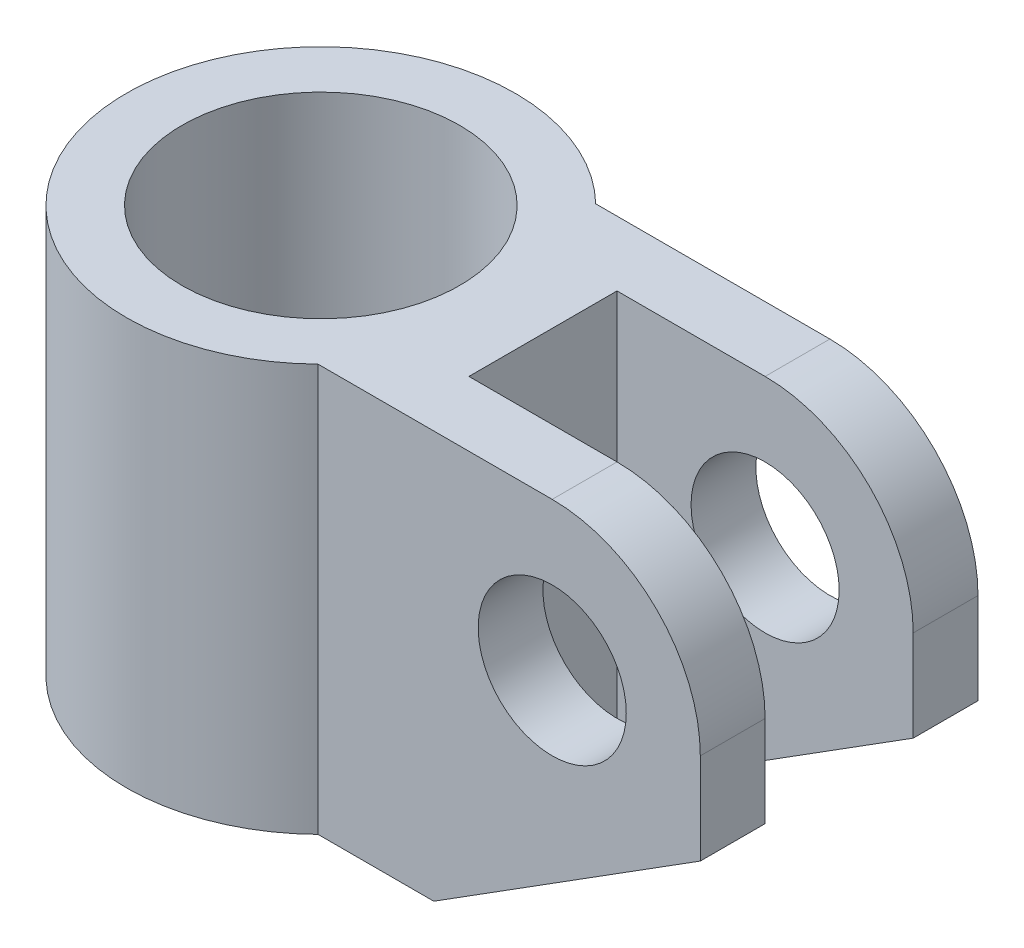
ISO-10303-21;
HEADER;
FILE_DESCRIPTION(('STEP AP214'),'2;1');
FILE_NAME('part.step','',(''),(''),'','','');
FILE_SCHEMA(('AUTOMOTIVE_DESIGN { 1 0 10303 214 1 1 1 1 }'));
ENDSEC;
DATA;
#1=APPLICATION_CONTEXT('core data for automotive mechanical design processes');
#2=APPLICATION_PROTOCOL_DEFINITION('international standard','automotive_design',2000,#1);
#3=PRODUCT_CONTEXT('',#1,'mechanical');
#4=PRODUCT('Part','Part','',(#3));
#5=PRODUCT_RELATED_PRODUCT_CATEGORY('part','',(#4));
#6=PRODUCT_DEFINITION_FORMATION('','',#4);
#7=PRODUCT_DEFINITION_CONTEXT('part definition',#1,'design');
#8=PRODUCT_DEFINITION('design','',#6,#7);
#9=PRODUCT_DEFINITION_SHAPE('','',#8);
#10=(LENGTH_UNIT() NAMED_UNIT(*) SI_UNIT(.MILLI.,.METRE.));
#11=(NAMED_UNIT(*) PLANE_ANGLE_UNIT() SI_UNIT($,.RADIAN.));
#12=(NAMED_UNIT(*) SI_UNIT($,.STERADIAN.) SOLID_ANGLE_UNIT());
#13=UNCERTAINTY_MEASURE_WITH_UNIT(LENGTH_MEASURE(1.E-05),#10,'distance_accuracy_value','');
#14=(GEOMETRIC_REPRESENTATION_CONTEXT(3) GLOBAL_UNCERTAINTY_ASSIGNED_CONTEXT((#13)) GLOBAL_UNIT_ASSIGNED_CONTEXT((#10,
#11,#12)) REPRESENTATION_CONTEXT('',''));
#15=CARTESIAN_POINT('',(0.,0.,0.));
#16=DIRECTION('',(0.,0.,1.));
#17=DIRECTION('',(1.,0.,0.));
#18=AXIS2_PLACEMENT_3D('',#15,#16,#17);
#19=CARTESIAN_POINT('',(0.,22.,0.));
#20=DIRECTION('',(0.,1.,0.));
#21=DIRECTION('',(0.,0.,1.));
#22=AXIS2_PLACEMENT_3D('',#19,#20,#21);
#23=PLANE('',#22);
#24=DIRECTION('',(0.,0.,1.));
#25=VECTOR('',#24,1.);
#26=CARTESIAN_POINT('',(20.,22.,-24.5206646639548));
#27=LINE('',#26,#25);
#28=CARTESIAN_POINT('',(20.,22.,-7.5));
#29=VERTEX_POINT('',#28);
#30=CARTESIAN_POINT('',(20.,22.,-4.));
#31=VERTEX_POINT('',#30);
#32=EDGE_CURVE('E57',#29,#31,#27,.T.);
#33=ORIENTED_EDGE('',*,*,#32,.F.);
#34=DIRECTION('',(-1.,0.,0.));
#35=VECTOR('',#34,1.);
#36=CARTESIAN_POINT('',(28.,22.,-7.5));
#37=LINE('',#36,#35);
#38=CARTESIAN_POINT('',(7.34846922834953,22.,-7.5));
#39=VERTEX_POINT('',#38);
#40=EDGE_CURVE('E196',#29,#39,#37,.T.);
#41=ORIENTED_EDGE('',*,*,#40,.T.);
#42=CARTESIAN_POINT('',(0.,22.,0.));
#43=DIRECTION('',(0.,1.,0.));
#44=DIRECTION('',(0.,0.,1.));
#45=AXIS2_PLACEMENT_3D('',#42,#43,#44);
#46=CIRCLE('',#45,10.5);
#47=CARTESIAN_POINT('',(7.34846922834953,22.,7.5));
#48=VERTEX_POINT('',#47);
#49=EDGE_CURVE('E198',#39,#48,#46,.T.);
#50=ORIENTED_EDGE('',*,*,#49,.T.);
#51=DIRECTION('',(1.,0.,0.));
#52=VECTOR('',#51,1.);
#53=CARTESIAN_POINT('',(28.,22.,7.5));
#54=LINE('',#53,#52);
#55=CARTESIAN_POINT('',(20.,22.,7.5));
#56=VERTEX_POINT('',#55);
#57=EDGE_CURVE('E201',#48,#56,#54,.T.);
#58=ORIENTED_EDGE('',*,*,#57,.T.);
#59=CARTESIAN_POINT('',(20.,22.,4.));
#60=VERTEX_POINT('',#59);
#61=EDGE_CURVE('E123',#60,#56,#27,.T.);
#62=ORIENTED_EDGE('',*,*,#61,.F.);
#63=DIRECTION('',(-1.,0.,0.));
#64=VECTOR('',#63,1.);
#65=CARTESIAN_POINT('',(28.,22.,4.));
#66=LINE('',#65,#64);
#67=CARTESIAN_POINT('',(12.,22.,4.));
#68=VERTEX_POINT('',#67);
#69=EDGE_CURVE('E203',#60,#68,#66,.T.);
#70=ORIENTED_EDGE('',*,*,#69,.T.);
#71=DIRECTION('',(0.,0.,-1.));
#72=VECTOR('',#71,1.);
#73=CARTESIAN_POINT('',(12.,22.,4.));
#74=LINE('',#73,#72);
#75=CARTESIAN_POINT('',(12.,22.,-4.));
#76=VERTEX_POINT('',#75);
#77=EDGE_CURVE('E205',#68,#76,#74,.T.);
#78=ORIENTED_EDGE('',*,*,#77,.T.);
#79=DIRECTION('',(1.,0.,0.));
#80=VECTOR('',#79,1.);
#81=CARTESIAN_POINT('',(28.,22.,-4.));
#82=LINE('',#81,#80);
#83=EDGE_CURVE('E207',#76,#31,#82,.T.);
#84=ORIENTED_EDGE('',*,*,#83,.T.);
#85=EDGE_LOOP('',(#33,#41,#50,#58,#62,#70,#78,#84));
#86=FACE_BOUND('',#85,.T.);
#87=CARTESIAN_POINT('',(0.,22.,0.));
#88=DIRECTION('',(0.,1.,0.));
#89=DIRECTION('',(0.,0.,1.));
#90=AXIS2_PLACEMENT_3D('',#87,#88,#89);
#91=CIRCLE('',#90,7.5);
#92=CARTESIAN_POINT('',(0.,22.,7.5));
#93=VERTEX_POINT('',#92);
#94=EDGE_CURVE('E190',#93,#93,#91,.T.);
#95=ORIENTED_EDGE('',*,*,#94,.F.);
#96=EDGE_LOOP('',(#95));
#97=FACE_BOUND('',#96,.T.);
#98=ADVANCED_FACE('F34',(#86,#97),#23,.T.);
#99=CARTESIAN_POINT('',(0.,0.,0.));
#100=DIRECTION('',(0.,1.,0.));
#101=DIRECTION('',(0.,0.,1.));
#102=AXIS2_PLACEMENT_3D('',#99,#100,#101);
#103=PLANE('',#102);
#104=DIRECTION('',(-1.,0.,0.));
#105=VECTOR('',#104,1.);
#106=CARTESIAN_POINT('',(28.,0.,-7.5));
#107=LINE('',#106,#105);
#108=CARTESIAN_POINT('',(13.6020077384735,0.,-7.5));
#109=VERTEX_POINT('',#108);
#110=CARTESIAN_POINT('',(7.34846922834953,0.,-7.5));
#111=VERTEX_POINT('',#110);
#112=EDGE_CURVE('E193',#109,#111,#107,.T.);
#113=ORIENTED_EDGE('',*,*,#112,.F.);
#114=DIRECTION('',(0.,0.,1.));
#115=VECTOR('',#114,1.);
#116=CARTESIAN_POINT('',(13.6020077384735,0.,-24.5206646639548));
#117=LINE('',#116,#115);
#118=CARTESIAN_POINT('',(13.6020077384735,0.,-4.));
#119=VERTEX_POINT('',#118);
#120=EDGE_CURVE('E176',#109,#119,#117,.T.);
#121=ORIENTED_EDGE('',*,*,#120,.T.);
#122=DIRECTION('',(1.,0.,0.));
#123=VECTOR('',#122,1.);
#124=CARTESIAN_POINT('',(28.,0.,-4.));
#125=LINE('',#124,#123);
#126=CARTESIAN_POINT('',(12.,0.,-4.));
#127=VERTEX_POINT('',#126);
#128=EDGE_CURVE('E199',#127,#119,#125,.T.);
#129=ORIENTED_EDGE('',*,*,#128,.F.);
#130=DIRECTION('',(0.,0.,-1.));
#131=VECTOR('',#130,1.);
#132=CARTESIAN_POINT('',(12.,0.,4.));
#133=LINE('',#132,#131);
#134=CARTESIAN_POINT('',(12.,0.,4.));
#135=VERTEX_POINT('',#134);
#136=EDGE_CURVE('E218',#135,#127,#133,.T.);
#137=ORIENTED_EDGE('',*,*,#136,.F.);
#138=DIRECTION('',(-1.,0.,0.));
#139=VECTOR('',#138,1.);
#140=CARTESIAN_POINT('',(28.,0.,4.));
#141=LINE('',#140,#139);
#142=CARTESIAN_POINT('',(13.6020077384735,0.,4.));
#143=VERTEX_POINT('',#142);
#144=EDGE_CURVE('E216',#143,#135,#141,.T.);
#145=ORIENTED_EDGE('',*,*,#144,.F.);
#146=CARTESIAN_POINT('',(13.6020077384735,0.,7.5));
#147=VERTEX_POINT('',#146);
#148=EDGE_CURVE('E180',#143,#147,#117,.T.);
#149=ORIENTED_EDGE('',*,*,#148,.T.);
#150=DIRECTION('',(1.,0.,0.));
#151=VECTOR('',#150,1.);
#152=CARTESIAN_POINT('',(28.,0.,7.5));
#153=LINE('',#152,#151);
#154=CARTESIAN_POINT('',(7.34846922834953,0.,7.5));
#155=VERTEX_POINT('',#154);
#156=EDGE_CURVE('E214',#155,#147,#153,.T.);
#157=ORIENTED_EDGE('',*,*,#156,.F.);
#158=CARTESIAN_POINT('',(0.,0.,0.));
#159=DIRECTION('',(0.,1.,0.));
#160=DIRECTION('',(0.,0.,1.));
#161=AXIS2_PLACEMENT_3D('',#158,#159,#160);
#162=CIRCLE('',#161,10.5);
#163=EDGE_CURVE('E212',#111,#155,#162,.T.);
#164=ORIENTED_EDGE('',*,*,#163,.F.);
#165=EDGE_LOOP('',(#113,#121,#129,#137,#145,#149,#157,#164));
#166=FACE_BOUND('',#165,.T.);
#167=CARTESIAN_POINT('',(0.,0.,0.));
#168=DIRECTION('',(0.,1.,0.));
#169=DIRECTION('',(0.,0.,1.));
#170=AXIS2_PLACEMENT_3D('',#167,#168,#169);
#171=CIRCLE('',#170,7.5);
#172=CARTESIAN_POINT('',(0.,0.,7.5));
#173=VERTEX_POINT('',#172);
#174=EDGE_CURVE('E189',#173,#173,#171,.T.);
#175=ORIENTED_EDGE('',*,*,#174,.T.);
#176=EDGE_LOOP('',(#175));
#177=FACE_BOUND('',#176,.T.);
#178=ADVANCED_FACE('F238',(#166,#177),#103,.F.);
#179=CARTESIAN_POINT('',(28.,22.,-7.5));
#180=DIRECTION('',(-1.,0.,0.));
#181=DIRECTION('',(0.,0.,1.));
#182=AXIS2_PLACEMENT_3D('',#179,#180,#181);
#183=PLANE('',#182);
#184=DIRECTION('',(0.,-1.,0.));
#185=VECTOR('',#184,1.);
#186=CARTESIAN_POINT('',(28.,22.,-7.5));
#187=LINE('',#186,#185);
#188=CARTESIAN_POINT('',(28.,14.,-7.5));
#189=VERTEX_POINT('',#188);
#190=CARTESIAN_POINT('',(28.,9.07749108728972,-7.5));
#191=VERTEX_POINT('',#190);
#192=EDGE_CURVE('E153',#189,#191,#187,.T.);
#193=ORIENTED_EDGE('',*,*,#192,.F.);
#194=DIRECTION('',(0.,0.,1.));
#195=VECTOR('',#194,1.);
#196=CARTESIAN_POINT('',(28.,14.,-24.5206646639548));
#197=LINE('',#196,#195);
#198=CARTESIAN_POINT('',(28.,14.,-4.));
#199=VERTEX_POINT('',#198);
#200=EDGE_CURVE('E136',#189,#199,#197,.T.);
#201=ORIENTED_EDGE('',*,*,#200,.T.);
#202=DIRECTION('',(0.,-1.,0.));
#203=VECTOR('',#202,1.);
#204=CARTESIAN_POINT('',(28.,22.,-4.));
#205=LINE('',#204,#203);
#206=CARTESIAN_POINT('',(28.,9.07749108728972,-4.));
#207=VERTEX_POINT('',#206);
#208=EDGE_CURVE('E210',#199,#207,#205,.T.);
#209=ORIENTED_EDGE('',*,*,#208,.T.);
#210=DIRECTION('',(0.,0.,1.));
#211=VECTOR('',#210,1.);
#212=CARTESIAN_POINT('',(28.,9.07749108728972,-24.5206646639548));
#213=LINE('',#212,#211);
#214=EDGE_CURVE('E181',#191,#207,#213,.T.);
#215=ORIENTED_EDGE('',*,*,#214,.F.);
#216=EDGE_LOOP('',(#193,#201,#209,#215));
#217=FACE_BOUND('',#216,.T.);
#218=ADVANCED_FACE('F36',(#217),#183,.F.);
#219=CARTESIAN_POINT('',(28.,22.,-7.5));
#220=DIRECTION('',(0.,0.,1.));
#221=DIRECTION('',(1.,0.,0.));
#222=AXIS2_PLACEMENT_3D('',#219,#220,#221);
#223=PLANE('',#222);
#224=CARTESIAN_POINT('',(20.,14.,-7.5));
#225=DIRECTION('',(0.,0.,1.));
#226=DIRECTION('',(1.,0.,0.));
#227=AXIS2_PLACEMENT_3D('',#224,#225,#226);
#228=CIRCLE('',#227,4.);
#229=CARTESIAN_POINT('',(24.,14.,-7.5));
#230=VERTEX_POINT('',#229);
#231=EDGE_CURVE('E159',#230,#230,#228,.F.);
#232=ORIENTED_EDGE('',*,*,#231,.F.);
#233=EDGE_LOOP('',(#232));
#234=FACE_BOUND('',#233,.T.);
#235=ORIENTED_EDGE('',*,*,#40,.F.);
#236=CARTESIAN_POINT('',(20.,14.,-7.5));
#237=DIRECTION('',(0.,0.,1.));
#238=DIRECTION('',(1.,0.,0.));
#239=AXIS2_PLACEMENT_3D('',#236,#237,#238);
#240=CIRCLE('',#239,8.);
#241=EDGE_CURVE('E250',#189,#29,#240,.T.);
#242=ORIENTED_EDGE('',*,*,#241,.F.);
#243=ORIENTED_EDGE('',*,*,#192,.T.);
#244=DIRECTION('',(0.845912456757199,0.53332177482548,0.));
#245=VECTOR('',#244,1.);
#246=CARTESIAN_POINT('',(28.,9.07749108728972,-7.5));
#247=LINE('',#246,#245);
#248=EDGE_CURVE('E179',#109,#191,#247,.T.);
#249=ORIENTED_EDGE('',*,*,#248,.F.);
#250=ORIENTED_EDGE('',*,*,#112,.T.);
#251=DIRECTION('',(0.,-1.,0.));
#252=VECTOR('',#251,1.);
#253=CARTESIAN_POINT('',(7.34846922834953,22.,-7.5));
#254=LINE('',#253,#252);
#255=EDGE_CURVE('E145',#39,#111,#254,.T.);
#256=ORIENTED_EDGE('',*,*,#255,.F.);
#257=EDGE_LOOP('',(#235,#242,#243,#249,#250,#256));
#258=FACE_BOUND('',#257,.T.);
#259=ADVANCED_FACE('F260',(#234,#258),#223,.F.);
#260=CARTESIAN_POINT('',(0.,22.,0.));
#261=DIRECTION('',(0.,-1.,0.));
#262=DIRECTION('',(0.,0.,-1.));
#263=AXIS2_PLACEMENT_3D('',#260,#261,#262);
#264=CYLINDRICAL_SURFACE('',#263,10.5);
#265=ORIENTED_EDGE('',*,*,#163,.T.);
#266=DIRECTION('',(0.,-1.,0.));
#267=VECTOR('',#266,1.);
#268=CARTESIAN_POINT('',(7.34846922834953,22.,7.5));
#269=LINE('',#268,#267);
#270=EDGE_CURVE('E142',#48,#155,#269,.T.);
#271=ORIENTED_EDGE('',*,*,#270,.F.);
#272=ORIENTED_EDGE('',*,*,#49,.F.);
#273=ORIENTED_EDGE('',*,*,#255,.T.);
#274=EDGE_LOOP('',(#265,#271,#272,#273));
#275=FACE_BOUND('',#274,.T.);
#276=ADVANCED_FACE('F266',(#275),#264,.T.);
#277=CARTESIAN_POINT('',(28.,22.,7.5));
#278=DIRECTION('',(0.,0.,-1.));
#279=DIRECTION('',(-1.,0.,0.));
#280=AXIS2_PLACEMENT_3D('',#277,#278,#279);
#281=PLANE('',#280);
#282=CARTESIAN_POINT('',(20.,14.,7.5));
#283=DIRECTION('',(0.,0.,1.));
#284=DIRECTION('',(1.,0.,0.));
#285=AXIS2_PLACEMENT_3D('',#282,#283,#284);
#286=CIRCLE('',#285,4.);
#287=CARTESIAN_POINT('',(24.,14.,7.5));
#288=VERTEX_POINT('',#287);
#289=EDGE_CURVE('E165',#288,#288,#286,.T.);
#290=ORIENTED_EDGE('',*,*,#289,.F.);
#291=EDGE_LOOP('',(#290));
#292=FACE_BOUND('',#291,.T.);
#293=DIRECTION('',(0.,-1.,0.));
#294=VECTOR('',#293,1.);
#295=CARTESIAN_POINT('',(28.,22.,7.5));
#296=LINE('',#295,#294);
#297=CARTESIAN_POINT('',(28.,14.,7.5));
#298=VERTEX_POINT('',#297);
#299=CARTESIAN_POINT('',(28.,9.07749108728972,7.5));
#300=VERTEX_POINT('',#299);
#301=EDGE_CURVE('E133',#298,#300,#296,.T.);
#302=ORIENTED_EDGE('',*,*,#301,.F.);
#303=CARTESIAN_POINT('',(20.,14.,7.5));
#304=DIRECTION('',(0.,0.,-1.));
#305=DIRECTION('',(1.,0.,0.));
#306=AXIS2_PLACEMENT_3D('',#303,#304,#305);
#307=CIRCLE('',#306,8.);
#308=EDGE_CURVE('E120',#56,#298,#307,.T.);
#309=ORIENTED_EDGE('',*,*,#308,.F.);
#310=ORIENTED_EDGE('',*,*,#57,.F.);
#311=ORIENTED_EDGE('',*,*,#270,.T.);
#312=ORIENTED_EDGE('',*,*,#156,.T.);
#313=DIRECTION('',(-0.845912456757199,-0.53332177482548,0.));
#314=VECTOR('',#313,1.);
#315=CARTESIAN_POINT('',(28.,9.07749108728972,7.5));
#316=LINE('',#315,#314);
#317=EDGE_CURVE('E141',#300,#147,#316,.T.);
#318=ORIENTED_EDGE('',*,*,#317,.F.);
#319=EDGE_LOOP('',(#302,#309,#310,#311,#312,#318));
#320=FACE_BOUND('',#319,.T.);
#321=ADVANCED_FACE('F139',(#292,#320),#281,.F.);
#322=CARTESIAN_POINT('',(28.,22.,4.));
#323=DIRECTION('',(-1.,0.,0.));
#324=DIRECTION('',(0.,0.,1.));
#325=AXIS2_PLACEMENT_3D('',#322,#323,#324);
#326=PLANE('',#325);
#327=DIRECTION('',(0.,-1.,0.));
#328=VECTOR('',#327,1.);
#329=CARTESIAN_POINT('',(28.,22.,4.));
#330=LINE('',#329,#328);
#331=CARTESIAN_POINT('',(28.,14.,4.));
#332=VERTEX_POINT('',#331);
#333=CARTESIAN_POINT('',(28.,9.07749108728972,4.));
#334=VERTEX_POINT('',#333);
#335=EDGE_CURVE('E135',#332,#334,#330,.T.);
#336=ORIENTED_EDGE('',*,*,#335,.F.);
#337=EDGE_CURVE('E49',#332,#298,#197,.T.);
#338=ORIENTED_EDGE('',*,*,#337,.T.);
#339=ORIENTED_EDGE('',*,*,#301,.T.);
#340=EDGE_CURVE('E175',#334,#300,#213,.T.);
#341=ORIENTED_EDGE('',*,*,#340,.F.);
#342=EDGE_LOOP('',(#336,#338,#339,#341));
#343=FACE_BOUND('',#342,.T.);
#344=ADVANCED_FACE('F131',(#343),#326,.F.);
#345=CARTESIAN_POINT('',(28.,22.,4.));
#346=DIRECTION('',(0.,0.,1.));
#347=DIRECTION('',(1.,0.,0.));
#348=AXIS2_PLACEMENT_3D('',#345,#346,#347);
#349=PLANE('',#348);
#350=CARTESIAN_POINT('',(20.,14.,4.));
#351=DIRECTION('',(0.,0.,1.));
#352=DIRECTION('',(1.,0.,0.));
#353=AXIS2_PLACEMENT_3D('',#350,#351,#352);
#354=CIRCLE('',#353,4.);
#355=CARTESIAN_POINT('',(24.,14.,4.));
#356=VERTEX_POINT('',#355);
#357=EDGE_CURVE('E158',#356,#356,#354,.T.);
#358=ORIENTED_EDGE('',*,*,#357,.T.);
#359=EDGE_LOOP('',(#358));
#360=FACE_BOUND('',#359,.T.);
#361=ORIENTED_EDGE('',*,*,#69,.F.);
#362=CARTESIAN_POINT('',(20.,14.,4.));
#363=DIRECTION('',(0.,0.,1.));
#364=DIRECTION('',(1.,0.,0.));
#365=AXIS2_PLACEMENT_3D('',#362,#363,#364);
#366=CIRCLE('',#365,8.);
#367=EDGE_CURVE('E170',#60,#332,#366,.F.);
#368=ORIENTED_EDGE('',*,*,#367,.T.);
#369=ORIENTED_EDGE('',*,*,#335,.T.);
#370=DIRECTION('',(-0.845912456757199,-0.53332177482548,0.));
#371=VECTOR('',#370,1.);
#372=CARTESIAN_POINT('',(33.8299063233223,12.7530676349383,4.));
#373=LINE('',#372,#371);
#374=EDGE_CURVE('E186',#334,#143,#373,.T.);
#375=ORIENTED_EDGE('',*,*,#374,.T.);
#376=ORIENTED_EDGE('',*,*,#144,.T.);
#377=DIRECTION('',(0.,-1.,0.));
#378=VECTOR('',#377,1.);
#379=CARTESIAN_POINT('',(12.,22.,4.));
#380=LINE('',#379,#378);
#381=EDGE_CURVE('E147',#68,#135,#380,.T.);
#382=ORIENTED_EDGE('',*,*,#381,.F.);
#383=EDGE_LOOP('',(#361,#368,#369,#375,#376,#382));
#384=FACE_BOUND('',#383,.T.);
#385=ADVANCED_FACE('F248',(#360,#384),#349,.F.);
#386=CARTESIAN_POINT('',(12.,22.,4.));
#387=DIRECTION('',(-1.,0.,0.));
#388=DIRECTION('',(0.,0.,1.));
#389=AXIS2_PLACEMENT_3D('',#386,#387,#388);
#390=PLANE('',#389);
#391=ORIENTED_EDGE('',*,*,#136,.T.);
#392=DIRECTION('',(0.,-1.,0.));
#393=VECTOR('',#392,1.);
#394=CARTESIAN_POINT('',(12.,22.,-4.));
#395=LINE('',#394,#393);
#396=EDGE_CURVE('E223',#76,#127,#395,.T.);
#397=ORIENTED_EDGE('',*,*,#396,.F.);
#398=ORIENTED_EDGE('',*,*,#77,.F.);
#399=ORIENTED_EDGE('',*,*,#381,.T.);
#400=EDGE_LOOP('',(#391,#397,#398,#399));
#401=FACE_BOUND('',#400,.T.);
#402=ADVANCED_FACE('F230',(#401),#390,.F.);
#403=CARTESIAN_POINT('',(28.,22.,-4.));
#404=DIRECTION('',(0.,0.,-1.));
#405=DIRECTION('',(-1.,0.,0.));
#406=AXIS2_PLACEMENT_3D('',#403,#404,#405);
#407=PLANE('',#406);
#408=CARTESIAN_POINT('',(20.,14.,-4.));
#409=DIRECTION('',(0.,0.,-1.));
#410=DIRECTION('',(-1.,0.,0.));
#411=AXIS2_PLACEMENT_3D('',#408,#409,#410);
#412=CIRCLE('',#411,4.);
#413=CARTESIAN_POINT('',(16.,14.,-4.));
#414=VERTEX_POINT('',#413);
#415=EDGE_CURVE('E156',#414,#414,#412,.T.);
#416=ORIENTED_EDGE('',*,*,#415,.T.);
#417=EDGE_LOOP('',(#416));
#418=FACE_BOUND('',#417,.T.);
#419=ORIENTED_EDGE('',*,*,#208,.F.);
#420=CARTESIAN_POINT('',(20.,14.,-4.));
#421=DIRECTION('',(0.,0.,-1.));
#422=DIRECTION('',(-1.,0.,0.));
#423=AXIS2_PLACEMENT_3D('',#420,#421,#422);
#424=CIRCLE('',#423,8.);
#425=EDGE_CURVE('E11',#199,#31,#424,.F.);
#426=ORIENTED_EDGE('',*,*,#425,.T.);
#427=ORIENTED_EDGE('',*,*,#83,.F.);
#428=ORIENTED_EDGE('',*,*,#396,.T.);
#429=ORIENTED_EDGE('',*,*,#128,.T.);
#430=DIRECTION('',(0.845912456757199,0.53332177482548,0.));
#431=VECTOR('',#430,1.);
#432=CARTESIAN_POINT('',(33.8299063233223,12.7530676349383,-4.));
#433=LINE('',#432,#431);
#434=EDGE_CURVE('E42',#119,#207,#433,.T.);
#435=ORIENTED_EDGE('',*,*,#434,.T.);
#436=EDGE_LOOP('',(#419,#426,#427,#428,#429,#435));
#437=FACE_BOUND('',#436,.T.);
#438=ADVANCED_FACE('F243',(#418,#437),#407,.F.);
#439=CARTESIAN_POINT('',(0.,22.,0.));
#440=DIRECTION('',(0.,-1.,0.));
#441=DIRECTION('',(0.,0.,-1.));
#442=AXIS2_PLACEMENT_3D('',#439,#440,#441);
#443=CYLINDRICAL_SURFACE('',#442,7.5);
#444=ORIENTED_EDGE('',*,*,#94,.T.);
#445=EDGE_LOOP('',(#444));
#446=FACE_BOUND('',#445,.T.);
#447=ORIENTED_EDGE('',*,*,#174,.F.);
#448=EDGE_LOOP('',(#447));
#449=FACE_BOUND('',#448,.T.);
#450=ADVANCED_FACE('F281',(#446,#449),#443,.F.);
#451=CARTESIAN_POINT('',(28.,9.07749108728972,-24.5206646639548));
#452=DIRECTION('',(-0.53332177482548,0.845912456757199,0.));
#453=DIRECTION('',(-0.845912456757199,-0.53332177482548,0.));
#454=AXIS2_PLACEMENT_3D('',#451,#452,#453);
#455=PLANE('',#454);
#456=ORIENTED_EDGE('',*,*,#120,.F.);
#457=ORIENTED_EDGE('',*,*,#248,.T.);
#458=ORIENTED_EDGE('',*,*,#214,.T.);
#459=ORIENTED_EDGE('',*,*,#434,.F.);
#460=EDGE_LOOP('',(#456,#457,#458,#459));
#461=FACE_BOUND('',#460,.T.);
#462=ADVANCED_FACE('F273',(#461),#455,.F.);
#463=ORIENTED_EDGE('',*,*,#340,.T.);
#464=ORIENTED_EDGE('',*,*,#317,.T.);
#465=ORIENTED_EDGE('',*,*,#148,.F.);
#466=ORIENTED_EDGE('',*,*,#374,.F.);
#467=EDGE_LOOP('',(#463,#464,#465,#466));
#468=FACE_BOUND('',#467,.T.);
#469=ADVANCED_FACE('F270',(#468),#455,.F.);
#470=CARTESIAN_POINT('',(20.,14.,-24.5206646639548));
#471=DIRECTION('',(0.,0.,1.));
#472=DIRECTION('',(1.,0.,0.));
#473=AXIS2_PLACEMENT_3D('',#470,#471,#472);
#474=CYLINDRICAL_SURFACE('',#473,4.);
#475=ORIENTED_EDGE('',*,*,#231,.T.);
#476=EDGE_LOOP('',(#475));
#477=FACE_BOUND('',#476,.T.);
#478=ORIENTED_EDGE('',*,*,#415,.F.);
#479=EDGE_LOOP('',(#478));
#480=FACE_BOUND('',#479,.T.);
#481=ADVANCED_FACE('F272',(#477,#480),#474,.F.);
#482=ORIENTED_EDGE('',*,*,#289,.T.);
#483=EDGE_LOOP('',(#482));
#484=FACE_BOUND('',#483,.T.);
#485=ORIENTED_EDGE('',*,*,#357,.F.);
#486=EDGE_LOOP('',(#485));
#487=FACE_BOUND('',#486,.T.);
#488=ADVANCED_FACE('F279',(#484,#487),#474,.F.);
#489=CARTESIAN_POINT('',(20.,14.,-24.5206646639548));
#490=DIRECTION('',(0.,0.,1.));
#491=DIRECTION('',(1.,0.,0.));
#492=AXIS2_PLACEMENT_3D('',#489,#490,#491);
#493=CYLINDRICAL_SURFACE('',#492,8.);
#494=ORIENTED_EDGE('',*,*,#200,.F.);
#495=ORIENTED_EDGE('',*,*,#241,.T.);
#496=ORIENTED_EDGE('',*,*,#32,.T.);
#497=ORIENTED_EDGE('',*,*,#425,.F.);
#498=EDGE_LOOP('',(#494,#495,#496,#497));
#499=FACE_BOUND('',#498,.T.);
#500=ADVANCED_FACE('F258',(#499),#493,.T.);
#501=ORIENTED_EDGE('',*,*,#61,.T.);
#502=ORIENTED_EDGE('',*,*,#308,.T.);
#503=ORIENTED_EDGE('',*,*,#337,.F.);
#504=ORIENTED_EDGE('',*,*,#367,.F.);
#505=EDGE_LOOP('',(#501,#502,#503,#504));
#506=FACE_BOUND('',#505,.T.);
#507=ADVANCED_FACE('F121',(#506),#493,.T.);
#508=CLOSED_SHELL('',(#98,#178,#218,#259,#276,#321,#344,#385,#402,#438,#450,#462,#469,#481,#488,
#500,#507));
#509=MANIFOLD_SOLID_BREP('B2',#508);
#510=ADVANCED_BREP_SHAPE_REPRESENTATION('',(#18,#509),#14);
#511=SHAPE_DEFINITION_REPRESENTATION(#9,#510);
ENDSEC;
END-ISO-10303-21;
